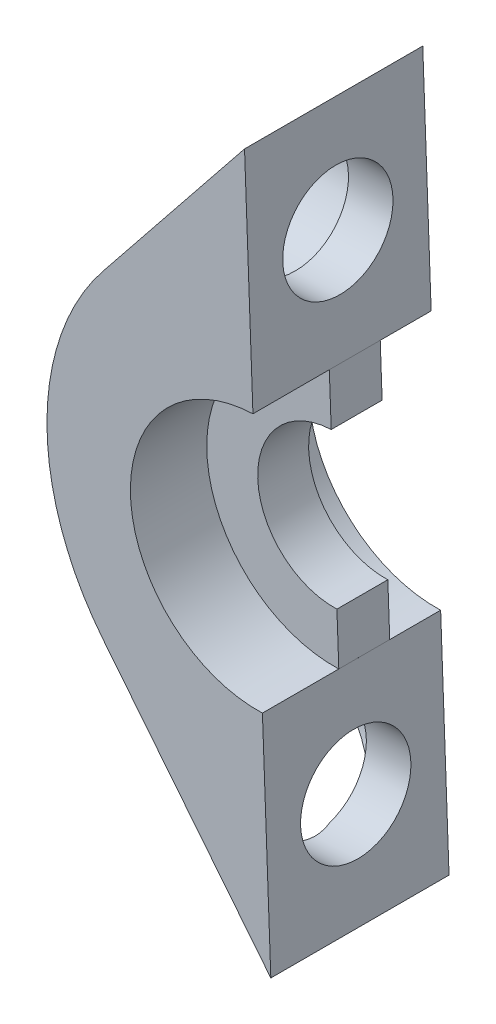
ISO-10303-21;
HEADER;
FILE_DESCRIPTION(('STEP AP214'),'2;1');
FILE_NAME('part.step','',(''),(''),'','','');
FILE_SCHEMA(('AUTOMOTIVE_DESIGN { 1 0 10303 214 1 1 1 1 }'));
ENDSEC;
DATA;
#1=APPLICATION_CONTEXT('core data for automotive mechanical design processes');
#2=APPLICATION_PROTOCOL_DEFINITION('international standard','automotive_design',2000,#1);
#3=PRODUCT_CONTEXT('',#1,'mechanical');
#4=PRODUCT('Part','Part','',(#3));
#5=PRODUCT_RELATED_PRODUCT_CATEGORY('part','',(#4));
#6=PRODUCT_DEFINITION_FORMATION('','',#4);
#7=PRODUCT_DEFINITION_CONTEXT('part definition',#1,'design');
#8=PRODUCT_DEFINITION('design','',#6,#7);
#9=PRODUCT_DEFINITION_SHAPE('','',#8);
#10=(LENGTH_UNIT() NAMED_UNIT(*) SI_UNIT(.MILLI.,.METRE.));
#11=(NAMED_UNIT(*) PLANE_ANGLE_UNIT() SI_UNIT($,.RADIAN.));
#12=(NAMED_UNIT(*) SI_UNIT($,.STERADIAN.) SOLID_ANGLE_UNIT());
#13=UNCERTAINTY_MEASURE_WITH_UNIT(LENGTH_MEASURE(1.E-05),#10,'distance_accuracy_value','');
#14=(GEOMETRIC_REPRESENTATION_CONTEXT(3) GLOBAL_UNCERTAINTY_ASSIGNED_CONTEXT((#13)) GLOBAL_UNIT_ASSIGNED_CONTEXT((#10,
#11,#12)) REPRESENTATION_CONTEXT('',''));
#15=CARTESIAN_POINT('',(0.,0.,0.));
#16=DIRECTION('',(0.,0.,1.));
#17=DIRECTION('',(1.,0.,0.));
#18=AXIS2_PLACEMENT_3D('',#15,#16,#17);
#19=CARTESIAN_POINT('',(0.,0.,7.));
#20=DIRECTION('',(0.,0.,-1.));
#21=DIRECTION('',(-1.,0.,0.));
#22=AXIS2_PLACEMENT_3D('',#19,#20,#21);
#23=CYLINDRICAL_SURFACE('',#22,10.);
#24=CARTESIAN_POINT('',(-7.80440053933433,6.25230615226398,1.58315274107681));
#25=CARTESIAN_POINT('',(-7.84024271005163,6.20757122298057,1.63534831848221));
#26=CARTESIAN_POINT('',(-7.87445225595147,6.16407609494398,1.68976140695611));
#27=CARTESIAN_POINT('',(-7.93947859183592,6.08008950105644,1.80289329337169));
#28=CARTESIAN_POINT('',(-7.9702911815187,6.03960177355621,1.86161727556053));
#29=CARTESIAN_POINT('',(-8.02776759652768,5.96298611141976,1.98198213426281));
#30=CARTESIAN_POINT('',(-8.05449797652163,5.92679104655812,2.04354835953453));
#31=CARTESIAN_POINT('',(-8.10433206286726,5.85846295010086,2.17023543140372));
#32=CARTESIAN_POINT('',(-8.12743892066376,5.82632639353435,2.23535312203296));
#33=CARTESIAN_POINT('',(-8.16084151105439,5.77936900881184,2.34023083111474));
#34=CARTESIAN_POINT('',(-8.1723887585691,5.76302225504204,2.37892047286833));
#35=CARTESIAN_POINT('',(-8.19431054818274,5.73180935719516,2.45747553029345));
#36=CARTESIAN_POINT('',(-8.2046784460619,5.71695165301358,2.49734615227001));
#37=CARTESIAN_POINT('',(-8.21441719494718,5.70292470118237,2.53766539415308));
#38=B_SPLINE_CURVE_WITH_KNOTS('',3,(#24,#25,#26,#27,#28,#29,#30,#31,#32,#33,#34,#35,#36,#37),
.UNSPECIFIED.,.F.,.F.,(4,2,2,2,2,2,4),(0.,0.232554493852084,0.46539338801284,0.693897788883213,
0.922202339626348,1.05283056794339,1.18416166037836),.UNSPECIFIED.);
#39=CARTESIAN_POINT('',(-7.80440053933434,6.25230615226397,1.58315274107681));
#40=VERTEX_POINT('',#39);
#41=CARTESIAN_POINT('',(-8.21441719494718,5.70292470118237,2.53766539415308));
#42=VERTEX_POINT('',#41);
#43=EDGE_CURVE('E292',#40,#42,#38,.T.);
#44=ORIENTED_EDGE('',*,*,#43,.F.);
#45=DIRECTION('',(0.,0.,-1.));
#46=VECTOR('',#45,1.);
#47=CARTESIAN_POINT('',(-7.80440053933434,6.25230615226397,7.));
#48=LINE('',#47,#46);
#49=CARTESIAN_POINT('',(-7.80440053933434,6.25230615226397,0.));
#50=VERTEX_POINT('',#49);
#51=EDGE_CURVE('E200',#40,#50,#48,.T.);
#52=ORIENTED_EDGE('',*,*,#51,.T.);
#53=CARTESIAN_POINT('',(0.,0.,0.));
#54=DIRECTION('',(0.,0.,1.));
#55=DIRECTION('',(1.,0.,0.));
#56=AXIS2_PLACEMENT_3D('',#53,#54,#55);
#57=CIRCLE('',#56,10.);
#58=CARTESIAN_POINT('',(-7.80440053933433,-6.25230615226398,0.));
#59=VERTEX_POINT('',#58);
#60=EDGE_CURVE('E218',#50,#59,#57,.T.);
#61=ORIENTED_EDGE('',*,*,#60,.T.);
#62=DIRECTION('',(0.,0.,-1.));
#63=VECTOR('',#62,1.);
#64=CARTESIAN_POINT('',(-7.80440053933433,-6.25230615226398,7.));
#65=LINE('',#64,#63);
#66=CARTESIAN_POINT('',(-7.80440053933433,-6.25230615226398,7.));
#67=VERTEX_POINT('',#66);
#68=EDGE_CURVE('E176',#67,#59,#65,.T.);
#69=ORIENTED_EDGE('',*,*,#68,.F.);
#70=CARTESIAN_POINT('',(0.,0.,7.));
#71=DIRECTION('',(0.,0.,1.));
#72=DIRECTION('',(1.,0.,0.));
#73=AXIS2_PLACEMENT_3D('',#70,#71,#72);
#74=CIRCLE('',#73,10.);
#75=CARTESIAN_POINT('',(-7.80440053933434,6.25230615226397,7.));
#76=VERTEX_POINT('',#75);
#77=EDGE_CURVE('E205',#76,#67,#74,.T.);
#78=ORIENTED_EDGE('',*,*,#77,.F.);
#79=CARTESIAN_POINT('',(-7.80440053933434,6.25230615226397,5.41684725892319));
#80=VERTEX_POINT('',#79);
#81=EDGE_CURVE('E196',#76,#80,#48,.T.);
#82=ORIENTED_EDGE('',*,*,#81,.T.);
#83=CARTESIAN_POINT('',(-8.21441719494718,5.70292470118237,4.46233460584692));
#84=CARTESIAN_POINT('',(-8.19717021948801,5.72776290505849,4.53377147614818));
#85=CARTESIAN_POINT('',(-8.17793628826433,5.75523112317168,4.60379356427726));
#86=CARTESIAN_POINT('',(-8.13560984205652,5.81491203452341,4.74055831492206));
#87=CARTESIAN_POINT('',(-8.11251813254083,5.84712373720015,4.80730165825284));
#88=CARTESIAN_POINT('',(-8.06301504319167,5.91519436642286,4.93596930065595));
#89=CARTESIAN_POINT('',(-8.03666783038476,5.95098075696293,4.9979568871694));
#90=CARTESIAN_POINT('',(-7.98049104395676,6.02610660183905,5.11804298731506));
#91=CARTESIAN_POINT('',(-7.95066289514775,6.06544460095335,5.1761430769573));
#92=CARTESIAN_POINT('',(-7.90116356780745,6.12963983947843,5.26424691321357));
#93=CARTESIAN_POINT('',(-7.88261082534087,6.15348678013398,5.29563066461933));
#94=CARTESIAN_POINT('',(-7.84434948934318,6.20218881291079,5.3571948422082));
#95=CARTESIAN_POINT('',(-7.82463553144014,6.22704838840905,5.38736839050426));
#96=CARTESIAN_POINT('',(-7.80440053933433,6.25230615226398,5.41684725892319));
#97=B_SPLINE_CURVE_WITH_KNOTS('',3,(#83,#84,#85,#86,#87,#88,#89,#90,#91,#92,#93,#94,#95,#96),
.UNSPECIFIED.,.F.,.F.,(4,2,2,2,2,2,4),(0.,0.232611476239105,0.46517444591199,0.69372392550767,
0.922180181505714,1.0528336928745,1.18414706725812),.UNSPECIFIED.);
#98=CARTESIAN_POINT('',(-8.21441719494718,5.70292470118237,4.46233460584692));
#99=VERTEX_POINT('',#98);
#100=EDGE_CURVE('E303',#99,#80,#97,.T.);
#101=ORIENTED_EDGE('',*,*,#100,.F.);
#102=DIRECTION('',(0.,0.,-1.));
#103=VECTOR('',#102,1.);
#104=CARTESIAN_POINT('',(-8.21441719494718,5.70292470118237,7.));
#105=LINE('',#104,#103);
#106=EDGE_CURVE('E11',#99,#42,#105,.T.);
#107=ORIENTED_EDGE('',*,*,#106,.T.);
#108=EDGE_LOOP('',(#44,#52,#61,#69,#78,#82,#101,#107));
#109=FACE_BOUND('',#108,.T.);
#110=ADVANCED_FACE('F38',(#109),#23,.T.);
#111=CARTESIAN_POINT('',(-1.20722600324309,-14.487186411432,7.));
#112=DIRECTION('',(0.780440053933433,0.625230615226398,0.));
#113=DIRECTION('',(-0.625230615226398,0.780440053933433,0.));
#114=AXIS2_PLACEMENT_3D('',#111,#112,#113);
#115=PLANE('',#114);
#116=DIRECTION('',(0.625230615226398,-0.780440053933433,0.));
#117=VECTOR('',#116,1.);
#118=CARTESIAN_POINT('',(-1.20722600324309,-14.487186411432,0.));
#119=LINE('',#118,#117);
#120=CARTESIAN_POINT('',(-1.20722600324309,-14.487186411432,0.));
#121=VERTEX_POINT('',#120);
#122=EDGE_CURVE('E215',#59,#121,#119,.T.);
#123=ORIENTED_EDGE('',*,*,#122,.T.);
#124=DIRECTION('',(0.,0.,-1.));
#125=VECTOR('',#124,1.);
#126=CARTESIAN_POINT('',(-1.20722600324309,-14.487186411432,7.));
#127=LINE('',#126,#125);
#128=CARTESIAN_POINT('',(-1.20722600324309,-14.487186411432,7.));
#129=VERTEX_POINT('',#128);
#130=EDGE_CURVE('E180',#129,#121,#127,.T.);
#131=ORIENTED_EDGE('',*,*,#130,.F.);
#132=DIRECTION('',(0.625230615226398,-0.780440053933433,0.));
#133=VECTOR('',#132,1.);
#134=CARTESIAN_POINT('',(-1.20722600324309,-14.487186411432,7.));
#135=LINE('',#134,#133);
#136=EDGE_CURVE('E235',#67,#129,#135,.T.);
#137=ORIENTED_EDGE('',*,*,#136,.F.);
#138=ORIENTED_EDGE('',*,*,#68,.T.);
#139=EDGE_LOOP('',(#123,#131,#137,#138));
#140=FACE_BOUND('',#139,.T.);
#141=DIRECTION('',(0.,0.,1.));
#142=VECTOR('',#141,1.);
#143=CARTESIAN_POINT('',(-3.04366949801377,-12.1948577486944,7.));
#144=LINE('',#143,#142);
#145=CARTESIAN_POINT('',(-3.04366949801377,-12.1948577486944,1.32582123675374));
#146=VERTEX_POINT('',#145);
#147=CARTESIAN_POINT('',(-3.04366949801377,-12.1948577486944,2.85635545947235));
#148=VERTEX_POINT('',#147);
#149=EDGE_CURVE('E61',#146,#148,#144,.T.);
#150=ORIENTED_EDGE('',*,*,#149,.F.);
#151=CARTESIAN_POINT('',(-4.65275199599971,-10.1863309732473,3.5));
#152=DIRECTION('',(0.780440053933433,0.625230615226398,0.));
#153=DIRECTION('',(0.625230615226398,-0.780440053933433,0.));
#154=AXIS2_PLACEMENT_3D('',#151,#152,#153);
#155=ELLIPSE('',#154,3.73504287975857,3.);
#156=CARTESIAN_POINT('',(-3.04366949801377,-12.1948577486944,5.67417876324626));
#157=VERTEX_POINT('',#156);
#158=EDGE_CURVE('E47',#157,#146,#155,.F.);
#159=ORIENTED_EDGE('',*,*,#158,.F.);
#160=CARTESIAN_POINT('',(-3.04366949801377,-12.1948577486944,4.14364454052764));
#161=VERTEX_POINT('',#160);
#162=EDGE_CURVE('E145',#161,#157,#144,.T.);
#163=ORIENTED_EDGE('',*,*,#162,.F.);
#164=CARTESIAN_POINT('',(-4.65275199599971,-10.1863309732473,3.5));
#165=DIRECTION('',(0.780440053933433,0.625230615226398,0.));
#166=DIRECTION('',(0.625230615226398,-0.780440053933433,0.));
#167=AXIS2_PLACEMENT_3D('',#164,#165,#166);
#168=ELLIPSE('',#167,2.69545594489243,2.165);
#169=EDGE_CURVE('E285',#148,#161,#168,.F.);
#170=ORIENTED_EDGE('',*,*,#169,.F.);
#171=EDGE_LOOP('',(#150,#159,#163,#170));
#172=FACE_BOUND('',#171,.T.);
#173=ADVANCED_FACE('F161',(#140,#172),#115,.F.);
#174=CARTESIAN_POINT('',(-2.23966649299222,13.1984492768771,7.));
#175=DIRECTION('',(0.780440053933434,-0.625230615226397,0.));
#176=DIRECTION('',(0.625230615226397,0.780440053933434,0.));
#177=AXIS2_PLACEMENT_3D('',#174,#175,#176);
#178=PLANE('',#177);
#179=CARTESIAN_POINT('',(-5.89732946778083,8.63279522892119,3.5));
#180=DIRECTION('',(0.780440053933434,-0.625230615226397,0.));
#181=DIRECTION('',(0.625230615226397,0.780440053933434,0.));
#182=AXIS2_PLACEMENT_3D('',#179,#180,#181);
#183=ELLIPSE('',#182,3.9651506037466,3.);
#184=CARTESIAN_POINT('',(-3.91297173887192,11.1097568735651,1.70169682162759));
#185=VERTEX_POINT('',#184);
#186=EDGE_CURVE('E163',#185,#40,#183,.F.);
#187=ORIENTED_EDGE('',*,*,#186,.F.);
#188=DIRECTION('',(0.,0.,-1.));
#189=VECTOR('',#188,1.);
#190=CARTESIAN_POINT('',(-3.91297173887192,11.1097568735651,7.));
#191=LINE('',#190,#189);
#192=CARTESIAN_POINT('',(-3.91297173887192,11.1097568735651,5.29830317837241));
#193=VERTEX_POINT('',#192);
#194=EDGE_CURVE('E173',#193,#185,#191,.T.);
#195=ORIENTED_EDGE('',*,*,#194,.F.);
#196=EDGE_CURVE('E165',#80,#193,#183,.F.);
#197=ORIENTED_EDGE('',*,*,#196,.F.);
#198=ORIENTED_EDGE('',*,*,#81,.F.);
#199=DIRECTION('',(-0.625230615226397,-0.780440053933434,0.));
#200=VECTOR('',#199,1.);
#201=CARTESIAN_POINT('',(-2.23966649299222,13.1984492768771,7.));
#202=LINE('',#201,#200);
#203=CARTESIAN_POINT('',(-2.23966649299222,13.1984492768771,7.));
#204=VERTEX_POINT('',#203);
#205=EDGE_CURVE('E223',#204,#76,#202,.T.);
#206=ORIENTED_EDGE('',*,*,#205,.F.);
#207=DIRECTION('',(0.,0.,-1.));
#208=VECTOR('',#207,1.);
#209=CARTESIAN_POINT('',(-2.23966649299222,13.1984492768771,7.));
#210=LINE('',#209,#208);
#211=CARTESIAN_POINT('',(-2.23966649299222,13.1984492768771,0.));
#212=VERTEX_POINT('',#211);
#213=EDGE_CURVE('E192',#204,#212,#210,.T.);
#214=ORIENTED_EDGE('',*,*,#213,.T.);
#215=DIRECTION('',(-0.625230615226397,-0.780440053933434,0.));
#216=VECTOR('',#215,1.);
#217=CARTESIAN_POINT('',(-2.23966649299222,13.1984492768771,0.));
#218=LINE('',#217,#216);
#219=EDGE_CURVE('E201',#212,#50,#218,.T.);
#220=ORIENTED_EDGE('',*,*,#219,.T.);
#221=ORIENTED_EDGE('',*,*,#51,.F.);
#222=EDGE_LOOP('',(#187,#195,#197,#198,#206,#214,#220,#221));
#223=FACE_BOUND('',#222,.T.);
#224=ADVANCED_FACE('F323',(#223),#178,.F.);
#225=CARTESIAN_POINT('',(-10.8565520608918,8.44780768962981,3.5));
#226=DIRECTION('',(0.999305015968233,0.0372757972514265,0.));
#227=DIRECTION('',(-0.0372757972514265,0.999305015968233,0.));
#228=AXIS2_PLACEMENT_3D('',#225,#226,#227);
#229=CYLINDRICAL_SURFACE('',#228,2.165);
#230=CARTESIAN_POINT('',(-2.07467864465776,8.7753866847518,3.5));
#231=DIRECTION('',(0.999305015968233,0.0372757972514265,0.));
#232=DIRECTION('',(-0.0372757972514265,0.999305015968233,0.));
#233=AXIS2_PLACEMENT_3D('',#230,#231,#232);
#234=CIRCLE('',#233,2.165);
#235=CARTESIAN_POINT('',(-2.1553807457071,10.938882044323,3.5));
#236=VERTEX_POINT('',#235);
#237=EDGE_CURVE('E270',#236,#236,#234,.T.);
#238=ORIENTED_EDGE('',*,*,#237,.T.);
#239=EDGE_LOOP('',(#238));
#240=FACE_BOUND('',#239,.T.);
#241=CARTESIAN_POINT('',(-3.82346242260217,8.7101540395618,3.5));
#242=DIRECTION('',(-0.999305015968233,-0.0372757972514265,0.));
#243=DIRECTION('',(0.0372757972514265,-0.999305015968233,0.));
#244=AXIS2_PLACEMENT_3D('',#241,#242,#243);
#245=CIRCLE('',#244,2.165);
#246=CARTESIAN_POINT('',(-3.74276032155283,6.54665867999058,3.5));
#247=VERTEX_POINT('',#246);
#248=EDGE_CURVE('E169',#247,#247,#245,.F.);
#249=ORIENTED_EDGE('',*,*,#248,.F.);
#250=EDGE_LOOP('',(#249));
#251=FACE_BOUND('',#250,.T.);
#252=ADVANCED_FACE('F318',(#240,#251),#229,.F.);
#253=CARTESIAN_POINT('',(-10.1538123361883,-10.3915299931982,3.5));
#254=DIRECTION('',(0.999305015968233,0.0372757972514265,0.));
#255=DIRECTION('',(-0.0372757972514265,0.999305015968233,0.));
#256=AXIS2_PLACEMENT_3D('',#253,#254,#255);
#257=CYLINDRICAL_SURFACE('',#256,2.165);
#258=CARTESIAN_POINT('',(-1.37213012372511,-10.063958130306,3.5));
#259=DIRECTION('',(-0.99930577239317,-0.0372555131717411,0.));
#260=DIRECTION('',(-0.0372555131717411,0.99930577239317,0.));
#261=AXIS2_PLACEMENT_3D('',#258,#259,#260);
#262=ELLIPSE('',#261,2.16500000044601,2.165);
#263=CARTESIAN_POINT('',(-1.45278830975855,-7.90046113262908,3.5));
#264=VERTEX_POINT('',#263);
#265=EDGE_CURVE('E288',#264,#264,#262,.F.);
#266=ORIENTED_EDGE('',*,*,#265,.T.);
#267=EDGE_LOOP('',(#266));
#268=FACE_BOUND('',#267,.T.);
#269=CARTESIAN_POINT('',(-3.12072269789875,-10.1291836432662,3.5));
#270=DIRECTION('',(-0.999305015968233,-0.0372757972514265,0.));
#271=DIRECTION('',(0.0372757972514265,-0.999305015968233,0.));
#272=AXIS2_PLACEMENT_3D('',#269,#270,#271);
#273=CIRCLE('',#272,2.165);
#274=EDGE_CURVE('E149',#148,#161,#273,.F.);
#275=ORIENTED_EDGE('',*,*,#274,.F.);
#276=ORIENTED_EDGE('',*,*,#169,.T.);
#277=EDGE_LOOP('',(#275,#276));
#278=FACE_BOUND('',#277,.T.);
#279=ADVANCED_FACE('F322',(#268,#278),#257,.F.);
#280=CARTESIAN_POINT('',(-1.72331181006615,-0.644200987214168,7.));
#281=DIRECTION('',(0.,0.,-1.));
#282=DIRECTION('',(-1.,0.,0.));
#283=AXIS2_PLACEMENT_3D('',#280,#281,#282);
#284=CYLINDRICAL_SURFACE('',#283,5.);
#285=CARTESIAN_POINT('',(-1.72331181006615,-0.644200987214168,0.));
#286=DIRECTION('',(0.,0.,-1.));
#287=DIRECTION('',(1.,0.,0.));
#288=AXIS2_PLACEMENT_3D('',#285,#286,#287);
#289=CIRCLE('',#288,5.);
#290=CARTESIAN_POINT('',(-1.53703424420714,-5.64072984918001,0.));
#291=VERTEX_POINT('',#290);
#292=CARTESIAN_POINT('',(-1.9096907963233,4.35232409262652,0.));
#293=VERTEX_POINT('',#292);
#294=EDGE_CURVE('E209',#291,#293,#289,.T.);
#295=ORIENTED_EDGE('',*,*,#294,.T.);
#296=DIRECTION('',(0.,0.,-1.));
#297=VECTOR('',#296,1.);
#298=CARTESIAN_POINT('',(-1.9096907963233,4.35232409262652,7.));
#299=LINE('',#298,#297);
#300=CARTESIAN_POINT('',(-1.9096907963233,4.35232409262652,7.));
#301=VERTEX_POINT('',#300);
#302=EDGE_CURVE('E188',#301,#293,#299,.T.);
#303=ORIENTED_EDGE('',*,*,#302,.F.);
#304=CARTESIAN_POINT('',(-1.72331181006615,-0.644200987214168,7.));
#305=DIRECTION('',(0.,0.,-1.));
#306=DIRECTION('',(1.,0.,0.));
#307=AXIS2_PLACEMENT_3D('',#304,#305,#306);
#308=CIRCLE('',#307,5.);
#309=CARTESIAN_POINT('',(-1.53703424420714,-5.64072984918001,7.));
#310=VERTEX_POINT('',#309);
#311=EDGE_CURVE('E229',#310,#301,#308,.T.);
#312=ORIENTED_EDGE('',*,*,#311,.F.);
#313=DIRECTION('',(0.,0.,-1.));
#314=VECTOR('',#313,1.);
#315=CARTESIAN_POINT('',(-1.53703424420714,-5.64072984918001,7.));
#316=LINE('',#315,#314);
#317=EDGE_CURVE('E184',#310,#291,#316,.T.);
#318=ORIENTED_EDGE('',*,*,#317,.T.);
#319=EDGE_LOOP('',(#295,#303,#312,#318));
#320=FACE_BOUND('',#319,.T.);
#321=CARTESIAN_POINT('',(-1.72331181006615,-0.644200987214168,2.));
#322=DIRECTION('',(0.,0.,1.));
#323=DIRECTION('',(1.,0.,0.));
#324=AXIS2_PLACEMENT_3D('',#321,#322,#323);
#325=CIRCLE('',#324,4.99999999999976);
#326=CARTESIAN_POINT('',(-1.90978057746201,4.35232074282799,2.));
#327=VERTEX_POINT('',#326);
#328=CARTESIAN_POINT('',(-1.5371240266636,-5.64073319558722,2.));
#329=VERTEX_POINT('',#328);
#330=EDGE_CURVE('E274',#327,#329,#325,.T.);
#331=ORIENTED_EDGE('',*,*,#330,.T.);
#332=DIRECTION('',(0.,0.,1.));
#333=VECTOR('',#332,1.);
#334=CARTESIAN_POINT('',(-1.5371240266636,-5.64073319558722,2.));
#335=LINE('',#334,#333);
#336=CARTESIAN_POINT('',(-1.5371240266636,-5.64073319558722,4.));
#337=VERTEX_POINT('',#336);
#338=EDGE_CURVE('E249',#329,#337,#335,.T.);
#339=ORIENTED_EDGE('',*,*,#338,.T.);
#340=CARTESIAN_POINT('',(-1.72331181006615,-0.644200987214168,4.));
#341=DIRECTION('',(0.,0.,1.));
#342=DIRECTION('',(1.,0.,0.));
#343=AXIS2_PLACEMENT_3D('',#340,#341,#342);
#344=CIRCLE('',#343,4.99999999999976);
#345=CARTESIAN_POINT('',(-1.90978057746202,4.35232074282823,4.));
#346=VERTEX_POINT('',#345);
#347=EDGE_CURVE('E260',#346,#337,#344,.T.);
#348=ORIENTED_EDGE('',*,*,#347,.F.);
#349=DIRECTION('',(0.,0.,1.));
#350=VECTOR('',#349,1.);
#351=CARTESIAN_POINT('',(-1.90978057746201,4.35232074282799,2.));
#352=LINE('',#351,#350);
#353=EDGE_CURVE('E244',#327,#346,#352,.T.);
#354=ORIENTED_EDGE('',*,*,#353,.F.);
#355=EDGE_LOOP('',(#331,#339,#348,#354));
#356=FACE_BOUND('',#355,.T.);
#357=ADVANCED_FACE('F327',(#320,#356),#284,.F.);
#358=CARTESIAN_POINT('',(-1.53703424420712,-5.64072984918048,7.));
#359=DIRECTION('',(-0.99930577239317,-0.0372555131717411,0.));
#360=DIRECTION('',(0.0372555131717411,-0.99930577239317,0.));
#361=AXIS2_PLACEMENT_3D('',#358,#359,#360);
#362=PLANE('',#361);
#363=ORIENTED_EDGE('',*,*,#265,.F.);
#364=EDGE_LOOP('',(#363));
#365=FACE_BOUND('',#364,.T.);
#366=DIRECTION('',(-0.0372555131717411,0.99930577239317,0.));
#367=VECTOR('',#366,1.);
#368=CARTESIAN_POINT('',(-1.53703424420712,-5.64072984918048,0.));
#369=LINE('',#368,#367);
#370=EDGE_CURVE('E212',#121,#291,#369,.T.);
#371=ORIENTED_EDGE('',*,*,#370,.T.);
#372=ORIENTED_EDGE('',*,*,#317,.F.);
#373=DIRECTION('',(-0.0372555131717411,0.99930577239317,0.));
#374=VECTOR('',#373,1.);
#375=CARTESIAN_POINT('',(-1.53703424420712,-5.64072984918048,7.));
#376=LINE('',#375,#374);
#377=EDGE_CURVE('E232',#129,#310,#376,.T.);
#378=ORIENTED_EDGE('',*,*,#377,.F.);
#379=ORIENTED_EDGE('',*,*,#130,.T.);
#380=EDGE_LOOP('',(#371,#372,#378,#379));
#381=FACE_BOUND('',#380,.T.);
#382=ADVANCED_FACE('F363',(#365,#381),#362,.F.);
#383=CARTESIAN_POINT('',(-2.23966649299222,13.1984492768771,7.));
#384=DIRECTION('',(-0.999305015968233,-0.0372757972514265,0.));
#385=DIRECTION('',(0.0372757972514265,-0.999305015968233,0.));
#386=AXIS2_PLACEMENT_3D('',#383,#384,#385);
#387=PLANE('',#386);
#388=ORIENTED_EDGE('',*,*,#237,.F.);
#389=EDGE_LOOP('',(#388));
#390=FACE_BOUND('',#389,.T.);
#391=DIRECTION('',(-0.0372757972514265,0.999305015968233,0.));
#392=VECTOR('',#391,1.);
#393=CARTESIAN_POINT('',(-2.23966649299222,13.1984492768771,0.));
#394=LINE('',#393,#392);
#395=EDGE_CURVE('E206',#293,#212,#394,.T.);
#396=ORIENTED_EDGE('',*,*,#395,.T.);
#397=ORIENTED_EDGE('',*,*,#213,.F.);
#398=DIRECTION('',(-0.0372757972514265,0.999305015968233,0.));
#399=VECTOR('',#398,1.);
#400=CARTESIAN_POINT('',(-2.23966649299222,13.1984492768771,7.));
#401=LINE('',#400,#399);
#402=EDGE_CURVE('E226',#301,#204,#401,.T.);
#403=ORIENTED_EDGE('',*,*,#402,.F.);
#404=ORIENTED_EDGE('',*,*,#302,.T.);
#405=EDGE_LOOP('',(#396,#397,#403,#404));
#406=FACE_BOUND('',#405,.T.);
#407=ADVANCED_FACE('F353',(#390,#406),#387,.F.);
#408=CARTESIAN_POINT('',(0.,0.,7.));
#409=DIRECTION('',(0.,0.,1.));
#410=DIRECTION('',(1.,0.,0.));
#411=AXIS2_PLACEMENT_3D('',#408,#409,#410);
#412=PLANE('',#411);
#413=ORIENTED_EDGE('',*,*,#77,.T.);
#414=ORIENTED_EDGE('',*,*,#136,.T.);
#415=ORIENTED_EDGE('',*,*,#377,.T.);
#416=ORIENTED_EDGE('',*,*,#311,.T.);
#417=ORIENTED_EDGE('',*,*,#402,.T.);
#418=ORIENTED_EDGE('',*,*,#205,.T.);
#419=EDGE_LOOP('',(#413,#414,#415,#416,#417,#418));
#420=FACE_BOUND('',#419,.T.);
#421=ADVANCED_FACE('F350',(#420),#412,.T.);
#422=CARTESIAN_POINT('',(0.,0.,0.));
#423=DIRECTION('',(0.,0.,1.));
#424=DIRECTION('',(1.,0.,0.));
#425=AXIS2_PLACEMENT_3D('',#422,#423,#424);
#426=PLANE('',#425);
#427=ORIENTED_EDGE('',*,*,#60,.F.);
#428=ORIENTED_EDGE('',*,*,#219,.F.);
#429=ORIENTED_EDGE('',*,*,#395,.F.);
#430=ORIENTED_EDGE('',*,*,#294,.F.);
#431=ORIENTED_EDGE('',*,*,#370,.F.);
#432=ORIENTED_EDGE('',*,*,#122,.F.);
#433=EDGE_LOOP('',(#427,#428,#429,#430,#431,#432));
#434=FACE_BOUND('',#433,.T.);
#435=ADVANCED_FACE('F348',(#434),#426,.F.);
#436=CARTESIAN_POINT('',(-1.72331181006615,-0.644200987214168,2.));
#437=DIRECTION('',(0.,0.,1.));
#438=DIRECTION('',(1.,0.,0.));
#439=AXIS2_PLACEMENT_3D('',#436,#437,#438);
#440=CYLINDRICAL_SURFACE('',#439,2.99999999999976);
#441=CARTESIAN_POINT('',(-1.72331181006615,-0.644200987214168,4.));
#442=DIRECTION('',(0.,0.,-1.));
#443=DIRECTION('',(1.,0.,0.));
#444=AXIS2_PLACEMENT_3D('',#441,#442,#443);
#445=CIRCLE('',#444,2.99999999999976);
#446=CARTESIAN_POINT('',(-1.61165533690185,-3.64212240579723,4.));
#447=VERTEX_POINT('',#446);
#448=CARTESIAN_POINT('',(-1.83524926722376,2.353709953038,4.));
#449=VERTEX_POINT('',#448);
#450=EDGE_CURVE('E266',#447,#449,#445,.T.);
#451=ORIENTED_EDGE('',*,*,#450,.F.);
#452=DIRECTION('',(0.,0.,1.));
#453=VECTOR('',#452,1.);
#454=CARTESIAN_POINT('',(-1.61165533690185,-3.64212240579723,2.));
#455=LINE('',#454,#453);
#456=CARTESIAN_POINT('',(-1.61165533690185,-3.64212240579723,2.));
#457=VERTEX_POINT('',#456);
#458=EDGE_CURVE('E222',#457,#447,#455,.T.);
#459=ORIENTED_EDGE('',*,*,#458,.F.);
#460=CARTESIAN_POINT('',(-1.72331181006615,-0.644200987214168,2.));
#461=DIRECTION('',(0.,0.,-1.));
#462=DIRECTION('',(1.,0.,0.));
#463=AXIS2_PLACEMENT_3D('',#460,#461,#462);
#464=CIRCLE('',#463,2.99999999999976);
#465=CARTESIAN_POINT('',(-1.83524926722376,2.353709953038,2.));
#466=VERTEX_POINT('',#465);
#467=EDGE_CURVE('E259',#457,#466,#464,.T.);
#468=ORIENTED_EDGE('',*,*,#467,.T.);
#469=DIRECTION('',(0.,0.,1.));
#470=VECTOR('',#469,1.);
#471=CARTESIAN_POINT('',(-1.83524926722376,2.353709953038,2.));
#472=LINE('',#471,#470);
#473=EDGE_CURVE('E241',#466,#449,#472,.T.);
#474=ORIENTED_EDGE('',*,*,#473,.T.);
#475=EDGE_LOOP('',(#451,#459,#468,#474));
#476=FACE_BOUND('',#475,.T.);
#477=ADVANCED_FACE('F341',(#476),#440,.F.);
#478=CARTESIAN_POINT('',(-1.61165533690185,-3.64212240579723,2.));
#479=DIRECTION('',(0.999305394236603,0.0372656550945754,0.));
#480=DIRECTION('',(-0.0372656550945754,0.999305394236603,0.));
#481=AXIS2_PLACEMENT_3D('',#478,#479,#480);
#482=PLANE('',#481);
#483=DIRECTION('',(-0.0372656550945754,0.999305394236603,0.));
#484=VECTOR('',#483,1.);
#485=CARTESIAN_POINT('',(-1.61165533690185,-3.64212240579723,4.));
#486=LINE('',#485,#484);
#487=EDGE_CURVE('E255',#337,#447,#486,.T.);
#488=ORIENTED_EDGE('',*,*,#487,.F.);
#489=ORIENTED_EDGE('',*,*,#338,.F.);
#490=DIRECTION('',(-0.0372656550945754,0.999305394236603,0.));
#491=VECTOR('',#490,1.);
#492=CARTESIAN_POINT('',(-1.61165533690185,-3.64212240579723,2.));
#493=LINE('',#492,#491);
#494=EDGE_CURVE('E245',#329,#457,#493,.T.);
#495=ORIENTED_EDGE('',*,*,#494,.T.);
#496=ORIENTED_EDGE('',*,*,#458,.T.);
#497=EDGE_LOOP('',(#488,#489,#495,#496));
#498=FACE_BOUND('',#497,.T.);
#499=ADVANCED_FACE('F338',(#498),#482,.T.);
#500=CARTESIAN_POINT('',(-1.90978057746201,4.35232074282799,2.));
#501=DIRECTION('',(0.999305394236603,0.037265655094575,0.));
#502=DIRECTION('',(-0.037265655094575,0.999305394236603,0.));
#503=AXIS2_PLACEMENT_3D('',#500,#501,#502);
#504=PLANE('',#503);
#505=DIRECTION('',(-0.037265655094575,0.999305394236603,0.));
#506=VECTOR('',#505,1.);
#507=CARTESIAN_POINT('',(-1.90978057746201,4.35232074282799,4.));
#508=LINE('',#507,#506);
#509=EDGE_CURVE('E263',#449,#346,#508,.T.);
#510=ORIENTED_EDGE('',*,*,#509,.F.);
#511=ORIENTED_EDGE('',*,*,#473,.F.);
#512=DIRECTION('',(-0.037265655094575,0.999305394236603,0.));
#513=VECTOR('',#512,1.);
#514=CARTESIAN_POINT('',(-1.90978057746201,4.35232074282799,2.));
#515=LINE('',#514,#513);
#516=EDGE_CURVE('E278',#466,#327,#515,.T.);
#517=ORIENTED_EDGE('',*,*,#516,.T.);
#518=ORIENTED_EDGE('',*,*,#353,.T.);
#519=EDGE_LOOP('',(#510,#511,#517,#518));
#520=FACE_BOUND('',#519,.T.);
#521=ADVANCED_FACE('F333',(#520),#504,.T.);
#522=CARTESIAN_POINT('',(-1.72331181006615,-0.644200987214168,2.));
#523=DIRECTION('',(0.,0.,1.));
#524=DIRECTION('',(1.,0.,0.));
#525=AXIS2_PLACEMENT_3D('',#522,#523,#524);
#526=PLANE('',#525);
#527=ORIENTED_EDGE('',*,*,#467,.F.);
#528=ORIENTED_EDGE('',*,*,#494,.F.);
#529=ORIENTED_EDGE('',*,*,#330,.F.);
#530=ORIENTED_EDGE('',*,*,#516,.F.);
#531=EDGE_LOOP('',(#527,#528,#529,#530));
#532=FACE_BOUND('',#531,.T.);
#533=ADVANCED_FACE('F329',(#532),#526,.F.);
#534=CARTESIAN_POINT('',(-1.72331181006615,-0.644200987214168,4.));
#535=DIRECTION('',(0.,0.,1.));
#536=DIRECTION('',(1.,0.,0.));
#537=AXIS2_PLACEMENT_3D('',#534,#535,#536);
#538=PLANE('',#537);
#539=ORIENTED_EDGE('',*,*,#450,.T.);
#540=ORIENTED_EDGE('',*,*,#509,.T.);
#541=ORIENTED_EDGE('',*,*,#347,.T.);
#542=ORIENTED_EDGE('',*,*,#487,.T.);
#543=EDGE_LOOP('',(#539,#540,#541,#542));
#544=FACE_BOUND('',#543,.T.);
#545=ADVANCED_FACE('F332',(#544),#538,.T.);
#546=CARTESIAN_POINT('',(-7.6175952697558,-10.2969247308976,3.5));
#547=DIRECTION('',(0.999305015968233,0.0372757972514265,0.));
#548=DIRECTION('',(-0.0372757972514265,0.999305015968233,0.));
#549=AXIS2_PLACEMENT_3D('',#546,#547,#548);
#550=CYLINDRICAL_SURFACE('',#549,3.);
#551=ORIENTED_EDGE('',*,*,#158,.T.);
#552=CARTESIAN_POINT('',(-3.12072269789875,-10.1291836432662,3.5));
#553=DIRECTION('',(-0.999305015968233,-0.0372757972514265,0.));
#554=DIRECTION('',(0.0372757972514265,-0.999305015968233,0.));
#555=AXIS2_PLACEMENT_3D('',#552,#553,#554);
#556=CIRCLE('',#555,3.);
#557=EDGE_CURVE('E148',#157,#146,#556,.T.);
#558=ORIENTED_EDGE('',*,*,#557,.F.);
#559=EDGE_LOOP('',(#551,#558));
#560=FACE_BOUND('',#559,.T.);
#561=ADVANCED_FACE('F157',(#560),#550,.F.);
#562=CARTESIAN_POINT('',(-3.12072269789875,-10.1291836432662,3.5));
#563=DIRECTION('',(-0.999305015968233,-0.0372757972514265,0.));
#564=DIRECTION('',(0.0372757972514265,-0.999305015968233,0.));
#565=AXIS2_PLACEMENT_3D('',#562,#563,#564);
#566=PLANE('',#565);
#567=ORIENTED_EDGE('',*,*,#149,.T.);
#568=ORIENTED_EDGE('',*,*,#274,.T.);
#569=ORIENTED_EDGE('',*,*,#162,.T.);
#570=ORIENTED_EDGE('',*,*,#557,.T.);
#571=EDGE_LOOP('',(#567,#568,#569,#570));
#572=FACE_BOUND('',#571,.T.);
#573=ADVANCED_FACE('F147',(#572),#566,.T.);
#574=CARTESIAN_POINT('',(-8.32033499445921,8.54241295193038,3.5));
#575=DIRECTION('',(-0.999305015968233,-0.0372757972514265,0.));
#576=DIRECTION('',(0.0372757972514265,-0.999305015968233,0.));
#577=AXIS2_PLACEMENT_3D('',#574,#575,#576);
#578=PLANE('',#577);
#579=CARTESIAN_POINT('',(-8.32033499445921,8.54241295193038,3.5));
#580=DIRECTION('',(-0.999305015968233,-0.0372757972514265,0.));
#581=DIRECTION('',(0.0372757972514265,-0.999305015968233,0.));
#582=AXIS2_PLACEMENT_3D('',#579,#580,#581);
#583=CIRCLE('',#582,3.);
#584=EDGE_CURVE('E159',#42,#99,#583,.T.);
#585=ORIENTED_EDGE('',*,*,#584,.F.);
#586=ORIENTED_EDGE('',*,*,#106,.F.);
#587=EDGE_LOOP('',(#585,#586));
#588=FACE_BOUND('',#587,.T.);
#589=ADVANCED_FACE('F315',(#588),#578,.F.);
#590=CARTESIAN_POINT('',(-8.32033499445921,8.54241295193038,3.5));
#591=DIRECTION('',(0.999305015968233,0.0372757972514265,0.));
#592=DIRECTION('',(-0.0372757972514265,0.999305015968233,0.));
#593=AXIS2_PLACEMENT_3D('',#590,#591,#592);
#594=CYLINDRICAL_SURFACE('',#593,3.);
#595=ORIENTED_EDGE('',*,*,#43,.T.);
#596=ORIENTED_EDGE('',*,*,#584,.T.);
#597=ORIENTED_EDGE('',*,*,#100,.T.);
#598=ORIENTED_EDGE('',*,*,#196,.T.);
#599=CARTESIAN_POINT('',(-3.82346242260217,8.7101540395618,3.5));
#600=DIRECTION('',(-0.999305015968233,-0.0372757972514265,0.));
#601=DIRECTION('',(0.0372757972514265,-0.999305015968233,0.));
#602=AXIS2_PLACEMENT_3D('',#599,#600,#601);
#603=CIRCLE('',#602,3.);
#604=EDGE_CURVE('E53',#185,#193,#603,.T.);
#605=ORIENTED_EDGE('',*,*,#604,.F.);
#606=ORIENTED_EDGE('',*,*,#186,.T.);
#607=EDGE_LOOP('',(#595,#596,#597,#598,#605,#606));
#608=FACE_BOUND('',#607,.T.);
#609=ADVANCED_FACE('F309',(#608),#594,.F.);
#610=CARTESIAN_POINT('',(-3.82346242260217,8.7101540395618,3.5));
#611=DIRECTION('',(-0.999305015968233,-0.0372757972514265,0.));
#612=DIRECTION('',(0.0372757972514265,-0.999305015968233,0.));
#613=AXIS2_PLACEMENT_3D('',#610,#611,#612);
#614=PLANE('',#613);
#615=ORIENTED_EDGE('',*,*,#248,.T.);
#616=EDGE_LOOP('',(#615));
#617=FACE_BOUND('',#616,.T.);
#618=ORIENTED_EDGE('',*,*,#194,.T.);
#619=ORIENTED_EDGE('',*,*,#604,.T.);
#620=EDGE_LOOP('',(#618,#619));
#621=FACE_BOUND('',#620,.T.);
#622=ADVANCED_FACE('F314',(#617,#621),#614,.T.);
#623=CLOSED_SHELL('',(#110,#173,#224,#252,#279,#357,#382,#407,#421,#435,#477,#499,#521,#533,
#545,#561,#573,#589,#609,#622));
#624=MANIFOLD_SOLID_BREP('B2',#623);
#625=ADVANCED_BREP_SHAPE_REPRESENTATION('',(#18,#624),#14);
#626=SHAPE_DEFINITION_REPRESENTATION(#9,#625);
ENDSEC;
END-ISO-10303-21;
